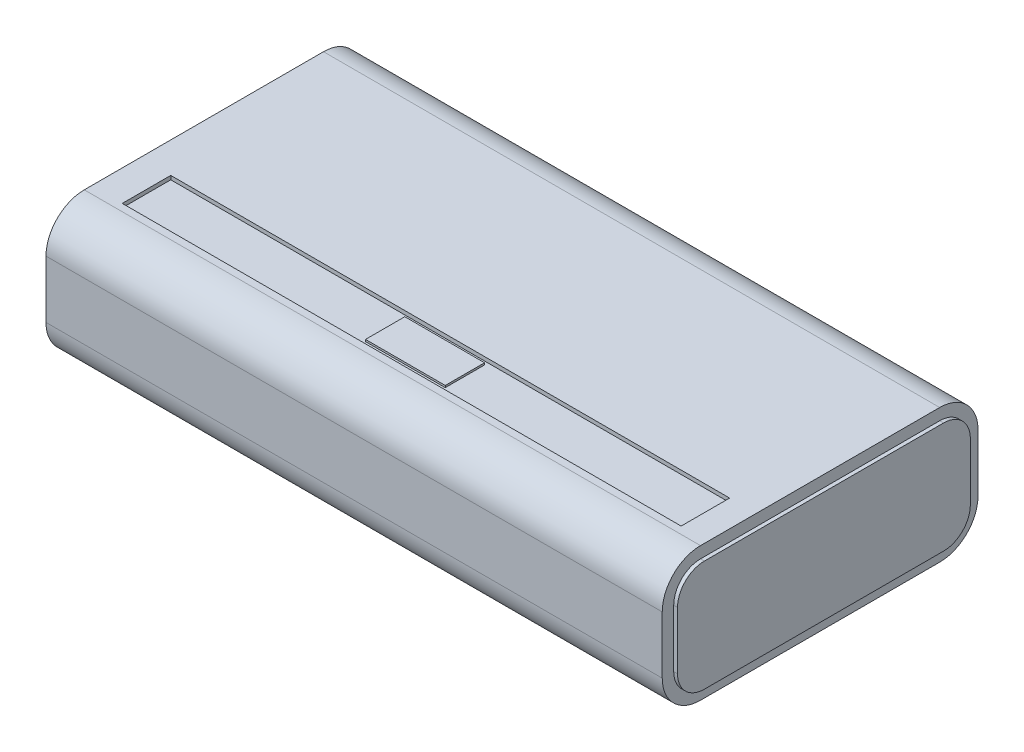
ISO-10303-21;
HEADER;
FILE_DESCRIPTION(('STEP AP214'),'2;1');
FILE_NAME('part.step','',(''),(''),'','','');
FILE_SCHEMA(('AUTOMOTIVE_DESIGN { 1 0 10303 214 1 1 1 1 }'));
ENDSEC;
DATA;
#1=APPLICATION_CONTEXT('core data for automotive mechanical design processes');
#2=APPLICATION_PROTOCOL_DEFINITION('international standard','automotive_design',2000,#1);
#3=PRODUCT_CONTEXT('',#1,'mechanical');
#4=PRODUCT('Part','Part','',(#3));
#5=PRODUCT_RELATED_PRODUCT_CATEGORY('part','',(#4));
#6=PRODUCT_DEFINITION_FORMATION('','',#4);
#7=PRODUCT_DEFINITION_CONTEXT('part definition',#1,'design');
#8=PRODUCT_DEFINITION('design','',#6,#7);
#9=PRODUCT_DEFINITION_SHAPE('','',#8);
#10=(LENGTH_UNIT() NAMED_UNIT(*) SI_UNIT(.MILLI.,.METRE.));
#11=(NAMED_UNIT(*) PLANE_ANGLE_UNIT() SI_UNIT($,.RADIAN.));
#12=(NAMED_UNIT(*) SI_UNIT($,.STERADIAN.) SOLID_ANGLE_UNIT());
#13=UNCERTAINTY_MEASURE_WITH_UNIT(LENGTH_MEASURE(1.E-05),#10,'distance_accuracy_value','');
#14=(GEOMETRIC_REPRESENTATION_CONTEXT(3) GLOBAL_UNCERTAINTY_ASSIGNED_CONTEXT((#13)) GLOBAL_UNIT_ASSIGNED_CONTEXT((#10,
#11,#12)) REPRESENTATION_CONTEXT('',''));
#15=CARTESIAN_POINT('',(0.,0.,0.));
#16=DIRECTION('',(0.,0.,1.));
#17=DIRECTION('',(1.,0.,0.));
#18=AXIS2_PLACEMENT_3D('',#15,#16,#17);
#19=CARTESIAN_POINT('',(0.,34.,0.));
#20=DIRECTION('',(0.,1.,0.));
#21=DIRECTION('',(0.,0.,1.));
#22=AXIS2_PLACEMENT_3D('',#19,#20,#21);
#23=PLANE('',#22);
#24=DIRECTION('',(0.,0.,1.));
#25=VECTOR('',#24,1.);
#26=CARTESIAN_POINT('',(-72.4679247913291,34.,29.3580079111993));
#27=LINE('',#26,#25);
#28=CARTESIAN_POINT('',(-72.4679247913291,34.,16.6877097600501));
#29=VERTEX_POINT('',#28);
#30=CARTESIAN_POINT('',(-72.4679247913291,34.,29.3580079111993));
#31=VERTEX_POINT('',#30);
#32=EDGE_CURVE('E350',#29,#31,#27,.T.);
#33=ORIENTED_EDGE('',*,*,#32,.T.);
#34=DIRECTION('',(1.,0.,0.));
#35=VECTOR('',#34,1.);
#36=CARTESIAN_POINT('',(73.5495356091101,34.,29.3580079111993));
#37=LINE('',#36,#35);
#38=CARTESIAN_POINT('',(73.5495356091101,34.,29.3580079111993));
#39=VERTEX_POINT('',#38);
#40=EDGE_CURVE('E354',#31,#39,#37,.T.);
#41=ORIENTED_EDGE('',*,*,#40,.T.);
#42=DIRECTION('',(0.,0.,-1.));
#43=VECTOR('',#42,1.);
#44=CARTESIAN_POINT('',(73.5495356091101,34.,29.3580079111993));
#45=LINE('',#44,#43);
#46=CARTESIAN_POINT('',(73.5495356091101,34.,16.6877097600501));
#47=VERTEX_POINT('',#46);
#48=EDGE_CURVE('E359',#39,#47,#45,.T.);
#49=ORIENTED_EDGE('',*,*,#48,.T.);
#50=DIRECTION('',(-1.,0.,0.));
#51=VECTOR('',#50,1.);
#52=CARTESIAN_POINT('',(73.5495356091101,34.,16.6877097600501));
#53=LINE('',#52,#51);
#54=EDGE_CURVE('E363',#47,#29,#53,.T.);
#55=ORIENTED_EDGE('',*,*,#54,.T.);
#56=EDGE_LOOP('',(#33,#41,#49,#55));
#57=FACE_BOUND('',#56,.T.);
#58=DIRECTION('',(1.,0.,0.));
#59=VECTOR('',#58,1.);
#60=CARTESIAN_POINT('',(10.4170922106721,34.,27.8556103776219));
#61=LINE('',#60,#59);
#62=CARTESIAN_POINT('',(-10.4170922106721,34.,27.8556103776219));
#63=VERTEX_POINT('',#62);
#64=CARTESIAN_POINT('',(10.4170922106721,34.,27.8556103776219));
#65=VERTEX_POINT('',#64);
#66=EDGE_CURVE('E1032',#63,#65,#61,.T.);
#67=ORIENTED_EDGE('',*,*,#66,.F.);
#68=DIRECTION('',(0.,0.,1.));
#69=VECTOR('',#68,1.);
#70=CARTESIAN_POINT('',(-10.4170922106721,34.,27.8556103776219));
#71=LINE('',#70,#69);
#72=CARTESIAN_POINT('',(-10.4170922106721,34.,17.5891447485538));
#73=VERTEX_POINT('',#72);
#74=EDGE_CURVE('E337',#73,#63,#71,.T.);
#75=ORIENTED_EDGE('',*,*,#74,.F.);
#76=DIRECTION('',(-1.,0.,0.));
#77=VECTOR('',#76,1.);
#78=CARTESIAN_POINT('',(10.4170922106721,34.,17.5891447485538));
#79=LINE('',#78,#77);
#80=CARTESIAN_POINT('',(10.4170922106721,34.,17.5891447485538));
#81=VERTEX_POINT('',#80);
#82=EDGE_CURVE('E333',#81,#73,#79,.T.);
#83=ORIENTED_EDGE('',*,*,#82,.F.);
#84=DIRECTION('',(0.,0.,-1.));
#85=VECTOR('',#84,1.);
#86=CARTESIAN_POINT('',(10.4170922106721,34.,27.8556103776219));
#87=LINE('',#86,#85);
#88=EDGE_CURVE('E1043',#65,#81,#87,.T.);
#89=ORIENTED_EDGE('',*,*,#88,.F.);
#90=EDGE_LOOP('',(#67,#75,#83,#89));
#91=FACE_BOUND('',#90,.T.);
#92=ADVANCED_FACE('F38',(#57,#91),#23,.T.);
#93=CARTESIAN_POINT('',(-80.5,35.,41.25));
#94=DIRECTION('',(1.,0.,0.));
#95=DIRECTION('',(0.,0.,-1.));
#96=AXIS2_PLACEMENT_3D('',#93,#94,#95);
#97=PLANE('',#96);
#98=DIRECTION('',(0.,0.,1.));
#99=VECTOR('',#98,1.);
#100=CARTESIAN_POINT('',(-80.5,35.,41.25));
#101=LINE('',#100,#99);
#102=CARTESIAN_POINT('',(-80.5,35.,-31.25));
#103=VERTEX_POINT('',#102);
#104=CARTESIAN_POINT('',(-80.5,35.,31.25));
#105=VERTEX_POINT('',#104);
#106=EDGE_CURVE('E568',#103,#105,#101,.T.);
#107=ORIENTED_EDGE('',*,*,#106,.F.);
#108=CARTESIAN_POINT('',(-80.5,25.,-31.25));
#109=DIRECTION('',(1.,0.,0.));
#110=DIRECTION('',(0.,0.,-1.));
#111=AXIS2_PLACEMENT_3D('',#108,#109,#110);
#112=CIRCLE('',#111,10.);
#113=CARTESIAN_POINT('',(-80.5,25.,-41.25));
#114=VERTEX_POINT('',#113);
#115=EDGE_CURVE('E616',#103,#114,#112,.F.);
#116=ORIENTED_EDGE('',*,*,#115,.T.);
#117=DIRECTION('',(0.,-1.,0.));
#118=VECTOR('',#117,1.);
#119=CARTESIAN_POINT('',(-80.5,35.,-41.25));
#120=LINE('',#119,#118);
#121=CARTESIAN_POINT('',(-80.5,10.,-41.25));
#122=VERTEX_POINT('',#121);
#123=EDGE_CURVE('E577',#114,#122,#120,.T.);
#124=ORIENTED_EDGE('',*,*,#123,.T.);
#125=CARTESIAN_POINT('',(-80.5,10.,-31.25));
#126=DIRECTION('',(1.,0.,0.));
#127=DIRECTION('',(0.,0.,-1.));
#128=AXIS2_PLACEMENT_3D('',#125,#126,#127);
#129=CIRCLE('',#128,10.);
#130=CARTESIAN_POINT('',(-80.5,0.,-31.25));
#131=VERTEX_POINT('',#130);
#132=EDGE_CURVE('E613',#122,#131,#129,.F.);
#133=ORIENTED_EDGE('',*,*,#132,.T.);
#134=DIRECTION('',(0.,0.,1.));
#135=VECTOR('',#134,1.);
#136=CARTESIAN_POINT('',(-80.5,0.,41.25));
#137=LINE('',#136,#135);
#138=CARTESIAN_POINT('',(-80.5,0.,31.25));
#139=VERTEX_POINT('',#138);
#140=EDGE_CURVE('E567',#131,#139,#137,.T.);
#141=ORIENTED_EDGE('',*,*,#140,.T.);
#142=CARTESIAN_POINT('',(-80.5,10.,31.25));
#143=DIRECTION('',(1.,0.,0.));
#144=DIRECTION('',(0.,0.,-1.));
#145=AXIS2_PLACEMENT_3D('',#142,#143,#144);
#146=CIRCLE('',#145,10.);
#147=CARTESIAN_POINT('',(-80.5,10.,41.25));
#148=VERTEX_POINT('',#147);
#149=EDGE_CURVE('E610',#139,#148,#146,.F.);
#150=ORIENTED_EDGE('',*,*,#149,.T.);
#151=DIRECTION('',(0.,-1.,0.));
#152=VECTOR('',#151,1.);
#153=CARTESIAN_POINT('',(-80.5,35.,41.25));
#154=LINE('',#153,#152);
#155=CARTESIAN_POINT('',(-80.5,25.,41.25));
#156=VERTEX_POINT('',#155);
#157=EDGE_CURVE('E595',#156,#148,#154,.T.);
#158=ORIENTED_EDGE('',*,*,#157,.F.);
#159=CARTESIAN_POINT('',(-80.5,25.,31.25));
#160=DIRECTION('',(1.,0.,0.));
#161=DIRECTION('',(0.,0.,-1.));
#162=AXIS2_PLACEMENT_3D('',#159,#160,#161);
#163=CIRCLE('',#162,10.);
#164=EDGE_CURVE('E607',#156,#105,#163,.F.);
#165=ORIENTED_EDGE('',*,*,#164,.T.);
#166=EDGE_LOOP('',(#107,#116,#124,#133,#141,#150,#158,#165));
#167=FACE_BOUND('',#166,.T.);
#168=CARTESIAN_POINT('',(-80.5,25.,31.25));
#169=DIRECTION('',(-1.,0.,0.));
#170=DIRECTION('',(0.,0.,1.));
#171=AXIS2_PLACEMENT_3D('',#168,#169,#170);
#172=CIRCLE('',#171,7.);
#173=CARTESIAN_POINT('',(-80.5,25.,38.25));
#174=VERTEX_POINT('',#173);
#175=CARTESIAN_POINT('',(-80.5,32.,31.25));
#176=VERTEX_POINT('',#175);
#177=EDGE_CURVE('E381',#174,#176,#172,.T.);
#178=ORIENTED_EDGE('',*,*,#177,.F.);
#179=DIRECTION('',(0.,1.,0.));
#180=VECTOR('',#179,1.);
#181=CARTESIAN_POINT('',(-80.5,10.,38.25));
#182=LINE('',#181,#180);
#183=CARTESIAN_POINT('',(-80.5,10.,38.25));
#184=VERTEX_POINT('',#183);
#185=EDGE_CURVE('E395',#184,#174,#182,.T.);
#186=ORIENTED_EDGE('',*,*,#185,.F.);
#187=CARTESIAN_POINT('',(-80.5,10.,31.25));
#188=DIRECTION('',(-1.,0.,0.));
#189=DIRECTION('',(0.,0.,1.));
#190=AXIS2_PLACEMENT_3D('',#187,#188,#189);
#191=CIRCLE('',#190,7.);
#192=CARTESIAN_POINT('',(-80.5,3.,31.25));
#193=VERTEX_POINT('',#192);
#194=EDGE_CURVE('E440',#193,#184,#191,.T.);
#195=ORIENTED_EDGE('',*,*,#194,.F.);
#196=DIRECTION('',(0.,0.,1.));
#197=VECTOR('',#196,1.);
#198=CARTESIAN_POINT('',(-80.5,3.,-31.25));
#199=LINE('',#198,#197);
#200=CARTESIAN_POINT('',(-80.5,3.,-31.25));
#201=VERTEX_POINT('',#200);
#202=EDGE_CURVE('E436',#201,#193,#199,.T.);
#203=ORIENTED_EDGE('',*,*,#202,.F.);
#204=CARTESIAN_POINT('',(-80.5,10.,-31.25));
#205=DIRECTION('',(-1.,0.,0.));
#206=DIRECTION('',(0.,0.,1.));
#207=AXIS2_PLACEMENT_3D('',#204,#205,#206);
#208=CIRCLE('',#207,7.);
#209=CARTESIAN_POINT('',(-80.5,10.,-38.25));
#210=VERTEX_POINT('',#209);
#211=EDGE_CURVE('E432',#210,#201,#208,.T.);
#212=ORIENTED_EDGE('',*,*,#211,.F.);
#213=DIRECTION('',(0.,-1.,0.));
#214=VECTOR('',#213,1.);
#215=CARTESIAN_POINT('',(-80.5,25.,-38.25));
#216=LINE('',#215,#214);
#217=CARTESIAN_POINT('',(-80.5,25.,-38.25));
#218=VERTEX_POINT('',#217);
#219=EDGE_CURVE('E428',#218,#210,#216,.T.);
#220=ORIENTED_EDGE('',*,*,#219,.F.);
#221=CARTESIAN_POINT('',(-80.5,25.,-31.25));
#222=DIRECTION('',(-1.,0.,0.));
#223=DIRECTION('',(0.,0.,1.));
#224=AXIS2_PLACEMENT_3D('',#221,#222,#223);
#225=CIRCLE('',#224,7.);
#226=CARTESIAN_POINT('',(-80.5,32.,-31.25));
#227=VERTEX_POINT('',#226);
#228=EDGE_CURVE('E424',#227,#218,#225,.T.);
#229=ORIENTED_EDGE('',*,*,#228,.F.);
#230=DIRECTION('',(0.,0.,-1.));
#231=VECTOR('',#230,1.);
#232=CARTESIAN_POINT('',(-80.5,32.,31.25));
#233=LINE('',#232,#231);
#234=EDGE_CURVE('E420',#176,#227,#233,.T.);
#235=ORIENTED_EDGE('',*,*,#234,.F.);
#236=EDGE_LOOP('',(#178,#186,#195,#203,#212,#220,#229,#235));
#237=FACE_BOUND('',#236,.T.);
#238=ADVANCED_FACE('F654',(#167,#237),#97,.F.);
#239=CARTESIAN_POINT('',(80.5,35.,41.25));
#240=DIRECTION('',(-1.,0.,0.));
#241=DIRECTION('',(0.,0.,1.));
#242=AXIS2_PLACEMENT_3D('',#239,#240,#241);
#243=PLANE('',#242);
#244=DIRECTION('',(0.,-1.,0.));
#245=VECTOR('',#244,1.);
#246=CARTESIAN_POINT('',(80.5,35.,-41.25));
#247=LINE('',#246,#245);
#248=CARTESIAN_POINT('',(80.5,25.,-41.25));
#249=VERTEX_POINT('',#248);
#250=CARTESIAN_POINT('',(80.5,10.,-41.25));
#251=VERTEX_POINT('',#250);
#252=EDGE_CURVE('E587',#249,#251,#247,.T.);
#253=ORIENTED_EDGE('',*,*,#252,.F.);
#254=CARTESIAN_POINT('',(80.5,25.,-31.25));
#255=DIRECTION('',(-1.,0.,0.));
#256=DIRECTION('',(0.,0.,1.));
#257=AXIS2_PLACEMENT_3D('',#254,#255,#256);
#258=CIRCLE('',#257,10.);
#259=CARTESIAN_POINT('',(80.5,35.,-31.25));
#260=VERTEX_POINT('',#259);
#261=EDGE_CURVE('E635',#249,#260,#258,.F.);
#262=ORIENTED_EDGE('',*,*,#261,.T.);
#263=DIRECTION('',(0.,0.,-1.));
#264=VECTOR('',#263,1.);
#265=CARTESIAN_POINT('',(80.5,35.,41.25));
#266=LINE('',#265,#264);
#267=CARTESIAN_POINT('',(80.5,35.,31.25));
#268=VERTEX_POINT('',#267);
#269=EDGE_CURVE('E572',#268,#260,#266,.T.);
#270=ORIENTED_EDGE('',*,*,#269,.F.);
#271=CARTESIAN_POINT('',(80.5,25.,31.25));
#272=DIRECTION('',(-1.,0.,0.));
#273=DIRECTION('',(0.,0.,1.));
#274=AXIS2_PLACEMENT_3D('',#271,#272,#273);
#275=CIRCLE('',#274,10.);
#276=CARTESIAN_POINT('',(80.5,25.,41.25));
#277=VERTEX_POINT('',#276);
#278=EDGE_CURVE('E626',#268,#277,#275,.F.);
#279=ORIENTED_EDGE('',*,*,#278,.T.);
#280=DIRECTION('',(0.,-1.,0.));
#281=VECTOR('',#280,1.);
#282=CARTESIAN_POINT('',(80.5,35.,41.25));
#283=LINE('',#282,#281);
#284=CARTESIAN_POINT('',(80.5,10.,41.25));
#285=VERTEX_POINT('',#284);
#286=EDGE_CURVE('E591',#277,#285,#283,.T.);
#287=ORIENTED_EDGE('',*,*,#286,.T.);
#288=CARTESIAN_POINT('',(80.5,10.,31.25));
#289=DIRECTION('',(-1.,0.,0.));
#290=DIRECTION('',(0.,0.,1.));
#291=AXIS2_PLACEMENT_3D('',#288,#289,#290);
#292=CIRCLE('',#291,10.);
#293=CARTESIAN_POINT('',(80.5,0.,31.25));
#294=VERTEX_POINT('',#293);
#295=EDGE_CURVE('E629',#285,#294,#292,.F.);
#296=ORIENTED_EDGE('',*,*,#295,.T.);
#297=DIRECTION('',(0.,0.,-1.));
#298=VECTOR('',#297,1.);
#299=CARTESIAN_POINT('',(80.5,0.,41.25));
#300=LINE('',#299,#298);
#301=CARTESIAN_POINT('',(80.5,0.,-31.25));
#302=VERTEX_POINT('',#301);
#303=EDGE_CURVE('E573',#294,#302,#300,.T.);
#304=ORIENTED_EDGE('',*,*,#303,.T.);
#305=CARTESIAN_POINT('',(80.5,10.,-31.25));
#306=DIRECTION('',(-1.,0.,0.));
#307=DIRECTION('',(0.,0.,1.));
#308=AXIS2_PLACEMENT_3D('',#305,#306,#307);
#309=CIRCLE('',#308,10.);
#310=EDGE_CURVE('E632',#302,#251,#309,.F.);
#311=ORIENTED_EDGE('',*,*,#310,.T.);
#312=EDGE_LOOP('',(#253,#262,#270,#279,#287,#296,#304,#311));
#313=FACE_BOUND('',#312,.T.);
#314=CARTESIAN_POINT('',(80.5,10.,-31.25));
#315=DIRECTION('',(1.,0.,0.));
#316=DIRECTION('',(0.,0.,-1.));
#317=AXIS2_PLACEMENT_3D('',#314,#315,#316);
#318=CIRCLE('',#317,7.);
#319=CARTESIAN_POINT('',(80.5,3.,-31.25));
#320=VERTEX_POINT('',#319);
#321=CARTESIAN_POINT('',(80.5,10.,-38.25));
#322=VERTEX_POINT('',#321);
#323=EDGE_CURVE('E478',#320,#322,#318,.T.);
#324=ORIENTED_EDGE('',*,*,#323,.F.);
#325=DIRECTION('',(0.,0.,-1.));
#326=VECTOR('',#325,1.);
#327=CARTESIAN_POINT('',(80.5,3.,31.25));
#328=LINE('',#327,#326);
#329=CARTESIAN_POINT('',(80.5,3.,31.25));
#330=VERTEX_POINT('',#329);
#331=EDGE_CURVE('E484',#330,#320,#328,.T.);
#332=ORIENTED_EDGE('',*,*,#331,.F.);
#333=CARTESIAN_POINT('',(80.5,10.,31.25));
#334=DIRECTION('',(1.,0.,0.));
#335=DIRECTION('',(0.,0.,-1.));
#336=AXIS2_PLACEMENT_3D('',#333,#334,#335);
#337=CIRCLE('',#336,7.);
#338=CARTESIAN_POINT('',(80.5,10.,38.25));
#339=VERTEX_POINT('',#338);
#340=EDGE_CURVE('E529',#339,#330,#337,.T.);
#341=ORIENTED_EDGE('',*,*,#340,.F.);
#342=DIRECTION('',(0.,-1.,0.));
#343=VECTOR('',#342,1.);
#344=CARTESIAN_POINT('',(80.5,25.,38.25));
#345=LINE('',#344,#343);
#346=CARTESIAN_POINT('',(80.5,25.,38.25));
#347=VERTEX_POINT('',#346);
#348=EDGE_CURVE('E525',#347,#339,#345,.T.);
#349=ORIENTED_EDGE('',*,*,#348,.F.);
#350=CARTESIAN_POINT('',(80.5,25.,31.25));
#351=DIRECTION('',(1.,0.,0.));
#352=DIRECTION('',(0.,0.,-1.));
#353=AXIS2_PLACEMENT_3D('',#350,#351,#352);
#354=CIRCLE('',#353,7.);
#355=CARTESIAN_POINT('',(80.5,32.,31.25));
#356=VERTEX_POINT('',#355);
#357=EDGE_CURVE('E521',#356,#347,#354,.T.);
#358=ORIENTED_EDGE('',*,*,#357,.F.);
#359=DIRECTION('',(0.,0.,1.));
#360=VECTOR('',#359,1.);
#361=CARTESIAN_POINT('',(80.5,32.,-31.25));
#362=LINE('',#361,#360);
#363=CARTESIAN_POINT('',(80.5,32.,-31.25));
#364=VERTEX_POINT('',#363);
#365=EDGE_CURVE('E517',#364,#356,#362,.T.);
#366=ORIENTED_EDGE('',*,*,#365,.F.);
#367=CARTESIAN_POINT('',(80.5,25.,-31.25));
#368=DIRECTION('',(1.,0.,0.));
#369=DIRECTION('',(0.,0.,-1.));
#370=AXIS2_PLACEMENT_3D('',#367,#368,#369);
#371=CIRCLE('',#370,7.);
#372=CARTESIAN_POINT('',(80.5,25.,-38.25));
#373=VERTEX_POINT('',#372);
#374=EDGE_CURVE('E513',#373,#364,#371,.T.);
#375=ORIENTED_EDGE('',*,*,#374,.F.);
#376=DIRECTION('',(0.,1.,0.));
#377=VECTOR('',#376,1.);
#378=CARTESIAN_POINT('',(80.5,10.,-38.25));
#379=LINE('',#378,#377);
#380=EDGE_CURVE('E509',#322,#373,#379,.T.);
#381=ORIENTED_EDGE('',*,*,#380,.F.);
#382=EDGE_LOOP('',(#324,#332,#341,#349,#358,#366,#375,#381));
#383=FACE_BOUND('',#382,.T.);
#384=ADVANCED_FACE('F664',(#313,#383),#243,.F.);
#385=CARTESIAN_POINT('',(80.5,35.,41.25));
#386=DIRECTION('',(0.,0.,-1.));
#387=DIRECTION('',(-1.,0.,0.));
#388=AXIS2_PLACEMENT_3D('',#385,#386,#387);
#389=PLANE('',#388);
#390=ORIENTED_EDGE('',*,*,#157,.T.);
#391=DIRECTION('',(1.,0.,0.));
#392=VECTOR('',#391,1.);
#393=CARTESIAN_POINT('',(80.5,10.,41.25));
#394=LINE('',#393,#392);
#395=EDGE_CURVE('E11',#148,#285,#394,.T.);
#396=ORIENTED_EDGE('',*,*,#395,.T.);
#397=ORIENTED_EDGE('',*,*,#286,.F.);
#398=DIRECTION('',(1.,0.,0.));
#399=VECTOR('',#398,1.);
#400=CARTESIAN_POINT('',(-80.5,25.,41.25));
#401=LINE('',#400,#399);
#402=EDGE_CURVE('E47',#277,#156,#401,.F.);
#403=ORIENTED_EDGE('',*,*,#402,.T.);
#404=EDGE_LOOP('',(#390,#396,#397,#403));
#405=FACE_BOUND('',#404,.T.);
#406=ADVANCED_FACE('F648',(#405),#389,.F.);
#407=CARTESIAN_POINT('',(80.5,35.,-41.25));
#408=DIRECTION('',(0.,0.,1.));
#409=DIRECTION('',(1.,0.,0.));
#410=AXIS2_PLACEMENT_3D('',#407,#408,#409);
#411=PLANE('',#410);
#412=ORIENTED_EDGE('',*,*,#123,.F.);
#413=DIRECTION('',(-1.,0.,0.));
#414=VECTOR('',#413,1.);
#415=CARTESIAN_POINT('',(80.5,25.,-41.25));
#416=LINE('',#415,#414);
#417=EDGE_CURVE('E623',#114,#249,#416,.F.);
#418=ORIENTED_EDGE('',*,*,#417,.T.);
#419=ORIENTED_EDGE('',*,*,#252,.T.);
#420=DIRECTION('',(-1.,0.,0.));
#421=VECTOR('',#420,1.);
#422=CARTESIAN_POINT('',(80.5,10.,-41.25));
#423=LINE('',#422,#421);
#424=EDGE_CURVE('E619',#251,#122,#423,.T.);
#425=ORIENTED_EDGE('',*,*,#424,.T.);
#426=EDGE_LOOP('',(#412,#418,#419,#425));
#427=FACE_BOUND('',#426,.T.);
#428=ADVANCED_FACE('F672',(#427),#411,.F.);
#429=CARTESIAN_POINT('',(0.,35.,0.));
#430=DIRECTION('',(0.,1.,0.));
#431=DIRECTION('',(0.,0.,1.));
#432=AXIS2_PLACEMENT_3D('',#429,#430,#431);
#433=PLANE('',#432);
#434=DIRECTION('',(0.,0.,1.));
#435=VECTOR('',#434,1.);
#436=CARTESIAN_POINT('',(-72.4679247913291,35.,29.3580079111993));
#437=LINE('',#436,#435);
#438=CARTESIAN_POINT('',(-72.4679247913291,35.,16.6877097600501));
#439=VERTEX_POINT('',#438);
#440=CARTESIAN_POINT('',(-72.4679247913291,35.,29.3580079111993));
#441=VERTEX_POINT('',#440);
#442=EDGE_CURVE('E68',#439,#441,#437,.T.);
#443=ORIENTED_EDGE('',*,*,#442,.F.);
#444=DIRECTION('',(-1.,0.,0.));
#445=VECTOR('',#444,1.);
#446=CARTESIAN_POINT('',(73.5495356091101,35.,16.6877097600501));
#447=LINE('',#446,#445);
#448=CARTESIAN_POINT('',(73.5495356091101,35.,16.6877097600501));
#449=VERTEX_POINT('',#448);
#450=EDGE_CURVE('E355',#449,#439,#447,.T.);
#451=ORIENTED_EDGE('',*,*,#450,.F.);
#452=DIRECTION('',(0.,0.,-1.));
#453=VECTOR('',#452,1.);
#454=CARTESIAN_POINT('',(73.5495356091101,35.,29.3580079111993));
#455=LINE('',#454,#453);
#456=CARTESIAN_POINT('',(73.5495356091101,35.,29.3580079111993));
#457=VERTEX_POINT('',#456);
#458=EDGE_CURVE('E371',#457,#449,#455,.T.);
#459=ORIENTED_EDGE('',*,*,#458,.F.);
#460=DIRECTION('',(1.,0.,0.));
#461=VECTOR('',#460,1.);
#462=CARTESIAN_POINT('',(73.5495356091101,35.,29.3580079111993));
#463=LINE('',#462,#461);
#464=EDGE_CURVE('E344',#441,#457,#463,.T.);
#465=ORIENTED_EDGE('',*,*,#464,.F.);
#466=EDGE_LOOP('',(#443,#451,#459,#465));
#467=FACE_BOUND('',#466,.T.);
#468=ORIENTED_EDGE('',*,*,#269,.T.);
#469=DIRECTION('',(-1.,0.,0.));
#470=VECTOR('',#469,1.);
#471=CARTESIAN_POINT('',(-80.5,35.,-31.25));
#472=LINE('',#471,#470);
#473=EDGE_CURVE('E603',#260,#103,#472,.T.);
#474=ORIENTED_EDGE('',*,*,#473,.T.);
#475=ORIENTED_EDGE('',*,*,#106,.T.);
#476=DIRECTION('',(1.,0.,0.));
#477=VECTOR('',#476,1.);
#478=CARTESIAN_POINT('',(80.5,35.,31.25));
#479=LINE('',#478,#477);
#480=EDGE_CURVE('E599',#105,#268,#479,.T.);
#481=ORIENTED_EDGE('',*,*,#480,.T.);
#482=EDGE_LOOP('',(#468,#474,#475,#481));
#483=FACE_BOUND('',#482,.T.);
#484=ADVANCED_FACE('F660',(#467,#483),#433,.T.);
#485=CARTESIAN_POINT('',(0.,0.,0.));
#486=DIRECTION('',(0.,1.,0.));
#487=DIRECTION('',(0.,0.,1.));
#488=AXIS2_PLACEMENT_3D('',#485,#486,#487);
#489=PLANE('',#488);
#490=ORIENTED_EDGE('',*,*,#140,.F.);
#491=DIRECTION('',(-1.,0.,0.));
#492=VECTOR('',#491,1.);
#493=CARTESIAN_POINT('',(0.,0.,-31.25));
#494=LINE('',#493,#492);
#495=EDGE_CURVE('E641',#131,#302,#494,.F.);
#496=ORIENTED_EDGE('',*,*,#495,.T.);
#497=ORIENTED_EDGE('',*,*,#303,.F.);
#498=DIRECTION('',(1.,0.,0.));
#499=VECTOR('',#498,1.);
#500=CARTESIAN_POINT('',(0.,0.,31.25));
#501=LINE('',#500,#499);
#502=EDGE_CURVE('E638',#294,#139,#501,.F.);
#503=ORIENTED_EDGE('',*,*,#502,.T.);
#504=EDGE_LOOP('',(#490,#496,#497,#503));
#505=FACE_BOUND('',#504,.T.);
#506=ADVANCED_FACE('F680',(#505),#489,.F.);
#507=CARTESIAN_POINT('',(0.,25.,-31.25));
#508=DIRECTION('',(1.,0.,0.));
#509=DIRECTION('',(0.,0.,-1.));
#510=AXIS2_PLACEMENT_3D('',#507,#508,#509);
#511=CYLINDRICAL_SURFACE('',#510,10.);
#512=ORIENTED_EDGE('',*,*,#261,.F.);
#513=ORIENTED_EDGE('',*,*,#417,.F.);
#514=ORIENTED_EDGE('',*,*,#115,.F.);
#515=ORIENTED_EDGE('',*,*,#473,.F.);
#516=EDGE_LOOP('',(#512,#513,#514,#515));
#517=FACE_BOUND('',#516,.T.);
#518=ADVANCED_FACE('F669',(#517),#511,.T.);
#519=CARTESIAN_POINT('',(80.5,10.,-31.25));
#520=DIRECTION('',(-1.,0.,0.));
#521=DIRECTION('',(0.,0.,1.));
#522=AXIS2_PLACEMENT_3D('',#519,#520,#521);
#523=CYLINDRICAL_SURFACE('',#522,10.);
#524=ORIENTED_EDGE('',*,*,#310,.F.);
#525=ORIENTED_EDGE('',*,*,#495,.F.);
#526=ORIENTED_EDGE('',*,*,#132,.F.);
#527=ORIENTED_EDGE('',*,*,#424,.F.);
#528=EDGE_LOOP('',(#524,#525,#526,#527));
#529=FACE_BOUND('',#528,.T.);
#530=ADVANCED_FACE('F676',(#529),#523,.T.);
#531=CARTESIAN_POINT('',(80.5,10.,31.25));
#532=DIRECTION('',(1.,0.,0.));
#533=DIRECTION('',(0.,0.,-1.));
#534=AXIS2_PLACEMENT_3D('',#531,#532,#533);
#535=CYLINDRICAL_SURFACE('',#534,10.);
#536=ORIENTED_EDGE('',*,*,#149,.F.);
#537=ORIENTED_EDGE('',*,*,#502,.F.);
#538=ORIENTED_EDGE('',*,*,#295,.F.);
#539=ORIENTED_EDGE('',*,*,#395,.F.);
#540=EDGE_LOOP('',(#536,#537,#538,#539));
#541=FACE_BOUND('',#540,.T.);
#542=ADVANCED_FACE('F684',(#541),#535,.T.);
#543=CARTESIAN_POINT('',(0.,25.,31.25));
#544=DIRECTION('',(-1.,0.,0.));
#545=DIRECTION('',(0.,0.,1.));
#546=AXIS2_PLACEMENT_3D('',#543,#544,#545);
#547=CYLINDRICAL_SURFACE('',#546,10.);
#548=ORIENTED_EDGE('',*,*,#164,.F.);
#549=ORIENTED_EDGE('',*,*,#402,.F.);
#550=ORIENTED_EDGE('',*,*,#278,.F.);
#551=ORIENTED_EDGE('',*,*,#480,.F.);
#552=EDGE_LOOP('',(#548,#549,#550,#551));
#553=FACE_BOUND('',#552,.T.);
#554=ADVANCED_FACE('F40',(#553),#547,.T.);
#555=CARTESIAN_POINT('',(81.5,10.,-31.25));
#556=DIRECTION('',(-1.,0.,0.));
#557=DIRECTION('',(0.,0.,1.));
#558=AXIS2_PLACEMENT_3D('',#555,#556,#557);
#559=CYLINDRICAL_SURFACE('',#558,7.);
#560=ORIENTED_EDGE('',*,*,#323,.T.);
#561=DIRECTION('',(-1.,0.,0.));
#562=VECTOR('',#561,1.);
#563=CARTESIAN_POINT('',(81.5,10.,-38.25));
#564=LINE('',#563,#562);
#565=CARTESIAN_POINT('',(81.5,10.,-38.25));
#566=VERTEX_POINT('',#565);
#567=EDGE_CURVE('E563',#566,#322,#564,.T.);
#568=ORIENTED_EDGE('',*,*,#567,.F.);
#569=CARTESIAN_POINT('',(81.5,10.,-31.25));
#570=DIRECTION('',(1.,0.,0.));
#571=DIRECTION('',(0.,0.,-1.));
#572=AXIS2_PLACEMENT_3D('',#569,#570,#571);
#573=CIRCLE('',#572,7.);
#574=CARTESIAN_POINT('',(81.5,3.,-31.25));
#575=VERTEX_POINT('',#574);
#576=EDGE_CURVE('E479',#575,#566,#573,.T.);
#577=ORIENTED_EDGE('',*,*,#576,.F.);
#578=DIRECTION('',(-1.,0.,0.));
#579=VECTOR('',#578,1.);
#580=CARTESIAN_POINT('',(81.5,3.,-31.25));
#581=LINE('',#580,#579);
#582=EDGE_CURVE('E505',#575,#320,#581,.T.);
#583=ORIENTED_EDGE('',*,*,#582,.T.);
#584=EDGE_LOOP('',(#560,#568,#577,#583));
#585=FACE_BOUND('',#584,.T.);
#586=ADVANCED_FACE('F690',(#585),#559,.T.);
#587=CARTESIAN_POINT('',(81.5,10.,-38.25));
#588=DIRECTION('',(0.,0.,1.));
#589=DIRECTION('',(1.,0.,0.));
#590=AXIS2_PLACEMENT_3D('',#587,#588,#589);
#591=PLANE('',#590);
#592=ORIENTED_EDGE('',*,*,#380,.T.);
#593=DIRECTION('',(-1.,0.,0.));
#594=VECTOR('',#593,1.);
#595=CARTESIAN_POINT('',(81.5,25.,-38.25));
#596=LINE('',#595,#594);
#597=CARTESIAN_POINT('',(81.5,25.,-38.25));
#598=VERTEX_POINT('',#597);
#599=EDGE_CURVE('E559',#598,#373,#596,.T.);
#600=ORIENTED_EDGE('',*,*,#599,.F.);
#601=DIRECTION('',(0.,1.,0.));
#602=VECTOR('',#601,1.);
#603=CARTESIAN_POINT('',(81.5,10.,-38.25));
#604=LINE('',#603,#602);
#605=EDGE_CURVE('E483',#566,#598,#604,.T.);
#606=ORIENTED_EDGE('',*,*,#605,.F.);
#607=ORIENTED_EDGE('',*,*,#567,.T.);
#608=EDGE_LOOP('',(#592,#600,#606,#607));
#609=FACE_BOUND('',#608,.T.);
#610=ADVANCED_FACE('F781',(#609),#591,.F.);
#611=CARTESIAN_POINT('',(81.5,25.,-31.25));
#612=DIRECTION('',(-1.,0.,0.));
#613=DIRECTION('',(0.,0.,1.));
#614=AXIS2_PLACEMENT_3D('',#611,#612,#613);
#615=CYLINDRICAL_SURFACE('',#614,7.);
#616=ORIENTED_EDGE('',*,*,#374,.T.);
#617=DIRECTION('',(-1.,0.,0.));
#618=VECTOR('',#617,1.);
#619=CARTESIAN_POINT('',(81.5,32.,-31.25));
#620=LINE('',#619,#618);
#621=CARTESIAN_POINT('',(81.5,32.,-31.25));
#622=VERTEX_POINT('',#621);
#623=EDGE_CURVE('E555',#622,#364,#620,.T.);
#624=ORIENTED_EDGE('',*,*,#623,.F.);
#625=CARTESIAN_POINT('',(81.5,25.,-31.25));
#626=DIRECTION('',(1.,0.,0.));
#627=DIRECTION('',(0.,0.,-1.));
#628=AXIS2_PLACEMENT_3D('',#625,#626,#627);
#629=CIRCLE('',#628,7.);
#630=EDGE_CURVE('E487',#598,#622,#629,.T.);
#631=ORIENTED_EDGE('',*,*,#630,.F.);
#632=ORIENTED_EDGE('',*,*,#599,.T.);
#633=EDGE_LOOP('',(#616,#624,#631,#632));
#634=FACE_BOUND('',#633,.T.);
#635=ADVANCED_FACE('F777',(#634),#615,.T.);
#636=CARTESIAN_POINT('',(81.5,32.,-31.25));
#637=DIRECTION('',(0.,-1.,0.));
#638=DIRECTION('',(0.,0.,-1.));
#639=AXIS2_PLACEMENT_3D('',#636,#637,#638);
#640=PLANE('',#639);
#641=ORIENTED_EDGE('',*,*,#365,.T.);
#642=DIRECTION('',(-1.,0.,0.));
#643=VECTOR('',#642,1.);
#644=CARTESIAN_POINT('',(81.5,32.,31.25));
#645=LINE('',#644,#643);
#646=CARTESIAN_POINT('',(81.5,32.,31.25));
#647=VERTEX_POINT('',#646);
#648=EDGE_CURVE('E551',#647,#356,#645,.T.);
#649=ORIENTED_EDGE('',*,*,#648,.F.);
#650=DIRECTION('',(0.,0.,1.));
#651=VECTOR('',#650,1.);
#652=CARTESIAN_POINT('',(81.5,32.,-31.25));
#653=LINE('',#652,#651);
#654=EDGE_CURVE('E490',#622,#647,#653,.T.);
#655=ORIENTED_EDGE('',*,*,#654,.F.);
#656=ORIENTED_EDGE('',*,*,#623,.T.);
#657=EDGE_LOOP('',(#641,#649,#655,#656));
#658=FACE_BOUND('',#657,.T.);
#659=ADVANCED_FACE('F773',(#658),#640,.F.);
#660=CARTESIAN_POINT('',(81.5,25.,31.25));
#661=DIRECTION('',(-1.,0.,0.));
#662=DIRECTION('',(0.,0.,1.));
#663=AXIS2_PLACEMENT_3D('',#660,#661,#662);
#664=CYLINDRICAL_SURFACE('',#663,7.);
#665=ORIENTED_EDGE('',*,*,#357,.T.);
#666=DIRECTION('',(-1.,0.,0.));
#667=VECTOR('',#666,1.);
#668=CARTESIAN_POINT('',(81.5,25.,38.25));
#669=LINE('',#668,#667);
#670=CARTESIAN_POINT('',(81.5,25.,38.25));
#671=VERTEX_POINT('',#670);
#672=EDGE_CURVE('E547',#671,#347,#669,.T.);
#673=ORIENTED_EDGE('',*,*,#672,.F.);
#674=CARTESIAN_POINT('',(81.5,25.,31.25));
#675=DIRECTION('',(1.,0.,0.));
#676=DIRECTION('',(0.,0.,-1.));
#677=AXIS2_PLACEMENT_3D('',#674,#675,#676);
#678=CIRCLE('',#677,7.);
#679=EDGE_CURVE('E493',#647,#671,#678,.T.);
#680=ORIENTED_EDGE('',*,*,#679,.F.);
#681=ORIENTED_EDGE('',*,*,#648,.T.);
#682=EDGE_LOOP('',(#665,#673,#680,#681));
#683=FACE_BOUND('',#682,.T.);
#684=ADVANCED_FACE('F769',(#683),#664,.T.);
#685=CARTESIAN_POINT('',(81.5,25.,38.25));
#686=DIRECTION('',(0.,0.,-1.));
#687=DIRECTION('',(-1.,0.,0.));
#688=AXIS2_PLACEMENT_3D('',#685,#686,#687);
#689=PLANE('',#688);
#690=ORIENTED_EDGE('',*,*,#348,.T.);
#691=DIRECTION('',(-1.,0.,0.));
#692=VECTOR('',#691,1.);
#693=CARTESIAN_POINT('',(81.5,10.,38.25));
#694=LINE('',#693,#692);
#695=CARTESIAN_POINT('',(81.5,10.,38.25));
#696=VERTEX_POINT('',#695);
#697=EDGE_CURVE('E543',#696,#339,#694,.T.);
#698=ORIENTED_EDGE('',*,*,#697,.F.);
#699=DIRECTION('',(0.,-1.,0.));
#700=VECTOR('',#699,1.);
#701=CARTESIAN_POINT('',(81.5,25.,38.25));
#702=LINE('',#701,#700);
#703=EDGE_CURVE('E496',#671,#696,#702,.T.);
#704=ORIENTED_EDGE('',*,*,#703,.F.);
#705=ORIENTED_EDGE('',*,*,#672,.T.);
#706=EDGE_LOOP('',(#690,#698,#704,#705));
#707=FACE_BOUND('',#706,.T.);
#708=ADVANCED_FACE('F765',(#707),#689,.F.);
#709=CARTESIAN_POINT('',(81.5,10.,31.25));
#710=DIRECTION('',(-1.,0.,0.));
#711=DIRECTION('',(0.,0.,1.));
#712=AXIS2_PLACEMENT_3D('',#709,#710,#711);
#713=CYLINDRICAL_SURFACE('',#712,7.);
#714=ORIENTED_EDGE('',*,*,#340,.T.);
#715=DIRECTION('',(-1.,0.,0.));
#716=VECTOR('',#715,1.);
#717=CARTESIAN_POINT('',(81.5,3.,31.25));
#718=LINE('',#717,#716);
#719=CARTESIAN_POINT('',(81.5,3.,31.25));
#720=VERTEX_POINT('',#719);
#721=EDGE_CURVE('E539',#720,#330,#718,.T.);
#722=ORIENTED_EDGE('',*,*,#721,.F.);
#723=CARTESIAN_POINT('',(81.5,10.,31.25));
#724=DIRECTION('',(1.,0.,0.));
#725=DIRECTION('',(0.,0.,-1.));
#726=AXIS2_PLACEMENT_3D('',#723,#724,#725);
#727=CIRCLE('',#726,7.);
#728=EDGE_CURVE('E499',#696,#720,#727,.T.);
#729=ORIENTED_EDGE('',*,*,#728,.F.);
#730=ORIENTED_EDGE('',*,*,#697,.T.);
#731=EDGE_LOOP('',(#714,#722,#729,#730));
#732=FACE_BOUND('',#731,.T.);
#733=ADVANCED_FACE('F761',(#732),#713,.T.);
#734=CARTESIAN_POINT('',(81.5,3.,31.25));
#735=DIRECTION('',(0.,1.,0.));
#736=DIRECTION('',(0.,0.,1.));
#737=AXIS2_PLACEMENT_3D('',#734,#735,#736);
#738=PLANE('',#737);
#739=ORIENTED_EDGE('',*,*,#331,.T.);
#740=ORIENTED_EDGE('',*,*,#582,.F.);
#741=DIRECTION('',(0.,0.,-1.));
#742=VECTOR('',#741,1.);
#743=CARTESIAN_POINT('',(81.5,3.,31.25));
#744=LINE('',#743,#742);
#745=EDGE_CURVE('E502',#720,#575,#744,.T.);
#746=ORIENTED_EDGE('',*,*,#745,.F.);
#747=ORIENTED_EDGE('',*,*,#721,.T.);
#748=EDGE_LOOP('',(#739,#740,#746,#747));
#749=FACE_BOUND('',#748,.T.);
#750=ADVANCED_FACE('F757',(#749),#738,.F.);
#751=CARTESIAN_POINT('',(81.5,10.,-31.25));
#752=DIRECTION('',(1.,0.,0.));
#753=DIRECTION('',(0.,0.,-1.));
#754=AXIS2_PLACEMENT_3D('',#751,#752,#753);
#755=PLANE('',#754);
#756=ORIENTED_EDGE('',*,*,#576,.T.);
#757=ORIENTED_EDGE('',*,*,#605,.T.);
#758=ORIENTED_EDGE('',*,*,#630,.T.);
#759=ORIENTED_EDGE('',*,*,#654,.T.);
#760=ORIENTED_EDGE('',*,*,#679,.T.);
#761=ORIENTED_EDGE('',*,*,#703,.T.);
#762=ORIENTED_EDGE('',*,*,#728,.T.);
#763=ORIENTED_EDGE('',*,*,#745,.T.);
#764=EDGE_LOOP('',(#756,#757,#758,#759,#760,#761,#762,#763));
#765=FACE_BOUND('',#764,.T.);
#766=ADVANCED_FACE('F753',(#765),#755,.T.);
#767=CARTESIAN_POINT('',(-81.5,25.,31.25));
#768=DIRECTION('',(1.,0.,0.));
#769=DIRECTION('',(0.,0.,-1.));
#770=AXIS2_PLACEMENT_3D('',#767,#768,#769);
#771=CYLINDRICAL_SURFACE('',#770,7.);
#772=ORIENTED_EDGE('',*,*,#177,.T.);
#773=DIRECTION('',(1.,0.,0.));
#774=VECTOR('',#773,1.);
#775=CARTESIAN_POINT('',(-81.5,32.,31.25));
#776=LINE('',#775,#774);
#777=CARTESIAN_POINT('',(-81.5,32.,31.25));
#778=VERTEX_POINT('',#777);
#779=EDGE_CURVE('E474',#778,#176,#776,.T.);
#780=ORIENTED_EDGE('',*,*,#779,.F.);
#781=CARTESIAN_POINT('',(-81.5,25.,31.25));
#782=DIRECTION('',(-1.,0.,0.));
#783=DIRECTION('',(0.,0.,1.));
#784=AXIS2_PLACEMENT_3D('',#781,#782,#783);
#785=CIRCLE('',#784,7.);
#786=CARTESIAN_POINT('',(-81.5,25.,38.25));
#787=VERTEX_POINT('',#786);
#788=EDGE_CURVE('E390',#787,#778,#785,.T.);
#789=ORIENTED_EDGE('',*,*,#788,.F.);
#790=DIRECTION('',(1.,0.,0.));
#791=VECTOR('',#790,1.);
#792=CARTESIAN_POINT('',(-81.5,25.,38.25));
#793=LINE('',#792,#791);
#794=EDGE_CURVE('E416',#787,#174,#793,.T.);
#795=ORIENTED_EDGE('',*,*,#794,.T.);
#796=EDGE_LOOP('',(#772,#780,#789,#795));
#797=FACE_BOUND('',#796,.T.);
#798=ADVANCED_FACE('F749',(#797),#771,.T.);
#799=CARTESIAN_POINT('',(-81.5,32.,31.25));
#800=DIRECTION('',(0.,-1.,0.));
#801=DIRECTION('',(0.,0.,-1.));
#802=AXIS2_PLACEMENT_3D('',#799,#800,#801);
#803=PLANE('',#802);
#804=ORIENTED_EDGE('',*,*,#234,.T.);
#805=DIRECTION('',(1.,0.,0.));
#806=VECTOR('',#805,1.);
#807=CARTESIAN_POINT('',(-81.5,32.,-31.25));
#808=LINE('',#807,#806);
#809=CARTESIAN_POINT('',(-81.5,32.,-31.25));
#810=VERTEX_POINT('',#809);
#811=EDGE_CURVE('E470',#810,#227,#808,.T.);
#812=ORIENTED_EDGE('',*,*,#811,.F.);
#813=DIRECTION('',(0.,0.,-1.));
#814=VECTOR('',#813,1.);
#815=CARTESIAN_POINT('',(-81.5,32.,31.25));
#816=LINE('',#815,#814);
#817=EDGE_CURVE('E394',#778,#810,#816,.T.);
#818=ORIENTED_EDGE('',*,*,#817,.F.);
#819=ORIENTED_EDGE('',*,*,#779,.T.);
#820=EDGE_LOOP('',(#804,#812,#818,#819));
#821=FACE_BOUND('',#820,.T.);
#822=ADVANCED_FACE('F745',(#821),#803,.F.);
#823=CARTESIAN_POINT('',(-81.5,25.,-31.25));
#824=DIRECTION('',(1.,0.,0.));
#825=DIRECTION('',(0.,0.,-1.));
#826=AXIS2_PLACEMENT_3D('',#823,#824,#825);
#827=CYLINDRICAL_SURFACE('',#826,7.);
#828=ORIENTED_EDGE('',*,*,#228,.T.);
#829=DIRECTION('',(1.,0.,0.));
#830=VECTOR('',#829,1.);
#831=CARTESIAN_POINT('',(-81.5,25.,-38.25));
#832=LINE('',#831,#830);
#833=CARTESIAN_POINT('',(-81.5,25.,-38.25));
#834=VERTEX_POINT('',#833);
#835=EDGE_CURVE('E466',#834,#218,#832,.T.);
#836=ORIENTED_EDGE('',*,*,#835,.F.);
#837=CARTESIAN_POINT('',(-81.5,25.,-31.25));
#838=DIRECTION('',(-1.,0.,0.));
#839=DIRECTION('',(0.,0.,1.));
#840=AXIS2_PLACEMENT_3D('',#837,#838,#839);
#841=CIRCLE('',#840,7.);
#842=EDGE_CURVE('E398',#810,#834,#841,.T.);
#843=ORIENTED_EDGE('',*,*,#842,.F.);
#844=ORIENTED_EDGE('',*,*,#811,.T.);
#845=EDGE_LOOP('',(#828,#836,#843,#844));
#846=FACE_BOUND('',#845,.T.);
#847=ADVANCED_FACE('F741',(#846),#827,.T.);
#848=CARTESIAN_POINT('',(-81.5,25.,-38.25));
#849=DIRECTION('',(0.,0.,1.));
#850=DIRECTION('',(1.,0.,0.));
#851=AXIS2_PLACEMENT_3D('',#848,#849,#850);
#852=PLANE('',#851);
#853=ORIENTED_EDGE('',*,*,#219,.T.);
#854=DIRECTION('',(1.,0.,0.));
#855=VECTOR('',#854,1.);
#856=CARTESIAN_POINT('',(-81.5,10.,-38.25));
#857=LINE('',#856,#855);
#858=CARTESIAN_POINT('',(-81.5,10.,-38.25));
#859=VERTEX_POINT('',#858);
#860=EDGE_CURVE('E462',#859,#210,#857,.T.);
#861=ORIENTED_EDGE('',*,*,#860,.F.);
#862=DIRECTION('',(0.,-1.,0.));
#863=VECTOR('',#862,1.);
#864=CARTESIAN_POINT('',(-81.5,25.,-38.25));
#865=LINE('',#864,#863);
#866=EDGE_CURVE('E401',#834,#859,#865,.T.);
#867=ORIENTED_EDGE('',*,*,#866,.F.);
#868=ORIENTED_EDGE('',*,*,#835,.T.);
#869=EDGE_LOOP('',(#853,#861,#867,#868));
#870=FACE_BOUND('',#869,.T.);
#871=ADVANCED_FACE('F737',(#870),#852,.F.);
#872=CARTESIAN_POINT('',(-81.5,10.,-31.25));
#873=DIRECTION('',(1.,0.,0.));
#874=DIRECTION('',(0.,0.,-1.));
#875=AXIS2_PLACEMENT_3D('',#872,#873,#874);
#876=CYLINDRICAL_SURFACE('',#875,7.);
#877=ORIENTED_EDGE('',*,*,#211,.T.);
#878=DIRECTION('',(1.,0.,0.));
#879=VECTOR('',#878,1.);
#880=CARTESIAN_POINT('',(-81.5,3.,-31.25));
#881=LINE('',#880,#879);
#882=CARTESIAN_POINT('',(-81.5,3.,-31.25));
#883=VERTEX_POINT('',#882);
#884=EDGE_CURVE('E458',#883,#201,#881,.T.);
#885=ORIENTED_EDGE('',*,*,#884,.F.);
#886=CARTESIAN_POINT('',(-81.5,10.,-31.25));
#887=DIRECTION('',(-1.,0.,0.));
#888=DIRECTION('',(0.,0.,1.));
#889=AXIS2_PLACEMENT_3D('',#886,#887,#888);
#890=CIRCLE('',#889,7.);
#891=EDGE_CURVE('E404',#859,#883,#890,.T.);
#892=ORIENTED_EDGE('',*,*,#891,.F.);
#893=ORIENTED_EDGE('',*,*,#860,.T.);
#894=EDGE_LOOP('',(#877,#885,#892,#893));
#895=FACE_BOUND('',#894,.T.);
#896=ADVANCED_FACE('F733',(#895),#876,.T.);
#897=CARTESIAN_POINT('',(-81.5,3.,-31.25));
#898=DIRECTION('',(0.,1.,0.));
#899=DIRECTION('',(0.,0.,1.));
#900=AXIS2_PLACEMENT_3D('',#897,#898,#899);
#901=PLANE('',#900);
#902=ORIENTED_EDGE('',*,*,#202,.T.);
#903=DIRECTION('',(1.,0.,0.));
#904=VECTOR('',#903,1.);
#905=CARTESIAN_POINT('',(-81.5,3.,31.25));
#906=LINE('',#905,#904);
#907=CARTESIAN_POINT('',(-81.5,3.,31.25));
#908=VERTEX_POINT('',#907);
#909=EDGE_CURVE('E454',#908,#193,#906,.T.);
#910=ORIENTED_EDGE('',*,*,#909,.F.);
#911=DIRECTION('',(0.,0.,1.));
#912=VECTOR('',#911,1.);
#913=CARTESIAN_POINT('',(-81.5,3.,-31.25));
#914=LINE('',#913,#912);
#915=EDGE_CURVE('E407',#883,#908,#914,.T.);
#916=ORIENTED_EDGE('',*,*,#915,.F.);
#917=ORIENTED_EDGE('',*,*,#884,.T.);
#918=EDGE_LOOP('',(#902,#910,#916,#917));
#919=FACE_BOUND('',#918,.T.);
#920=ADVANCED_FACE('F729',(#919),#901,.F.);
#921=CARTESIAN_POINT('',(-81.5,10.,31.25));
#922=DIRECTION('',(1.,0.,0.));
#923=DIRECTION('',(0.,0.,-1.));
#924=AXIS2_PLACEMENT_3D('',#921,#922,#923);
#925=CYLINDRICAL_SURFACE('',#924,7.);
#926=ORIENTED_EDGE('',*,*,#194,.T.);
#927=DIRECTION('',(1.,0.,0.));
#928=VECTOR('',#927,1.);
#929=CARTESIAN_POINT('',(-81.5,10.,38.25));
#930=LINE('',#929,#928);
#931=CARTESIAN_POINT('',(-81.5,10.,38.25));
#932=VERTEX_POINT('',#931);
#933=EDGE_CURVE('E450',#932,#184,#930,.T.);
#934=ORIENTED_EDGE('',*,*,#933,.F.);
#935=CARTESIAN_POINT('',(-81.5,10.,31.25));
#936=DIRECTION('',(-1.,0.,0.));
#937=DIRECTION('',(0.,0.,1.));
#938=AXIS2_PLACEMENT_3D('',#935,#936,#937);
#939=CIRCLE('',#938,7.);
#940=EDGE_CURVE('E410',#908,#932,#939,.T.);
#941=ORIENTED_EDGE('',*,*,#940,.F.);
#942=ORIENTED_EDGE('',*,*,#909,.T.);
#943=EDGE_LOOP('',(#926,#934,#941,#942));
#944=FACE_BOUND('',#943,.T.);
#945=ADVANCED_FACE('F725',(#944),#925,.T.);
#946=CARTESIAN_POINT('',(-81.5,10.,38.25));
#947=DIRECTION('',(0.,0.,-1.));
#948=DIRECTION('',(-1.,0.,0.));
#949=AXIS2_PLACEMENT_3D('',#946,#947,#948);
#950=PLANE('',#949);
#951=ORIENTED_EDGE('',*,*,#185,.T.);
#952=ORIENTED_EDGE('',*,*,#794,.F.);
#953=DIRECTION('',(0.,1.,0.));
#954=VECTOR('',#953,1.);
#955=CARTESIAN_POINT('',(-81.5,10.,38.25));
#956=LINE('',#955,#954);
#957=EDGE_CURVE('E413',#932,#787,#956,.T.);
#958=ORIENTED_EDGE('',*,*,#957,.F.);
#959=ORIENTED_EDGE('',*,*,#933,.T.);
#960=EDGE_LOOP('',(#951,#952,#958,#959));
#961=FACE_BOUND('',#960,.T.);
#962=ADVANCED_FACE('F721',(#961),#950,.F.);
#963=CARTESIAN_POINT('',(-81.5,25.,31.25));
#964=DIRECTION('',(-1.,0.,0.));
#965=DIRECTION('',(0.,0.,1.));
#966=AXIS2_PLACEMENT_3D('',#963,#964,#965);
#967=PLANE('',#966);
#968=CARTESIAN_POINT('',(-81.5,17.3044853364008,0.));
#969=DIRECTION('',(-1.,0.,0.));
#970=DIRECTION('',(0.,0.,1.));
#971=AXIS2_PLACEMENT_3D('',#968,#969,#970);
#972=CIRCLE('',#971,8.60593277136364);
#973=CARTESIAN_POINT('',(-81.5,17.3044853364008,8.60593277136364));
#974=VERTEX_POINT('',#973);
#975=EDGE_CURVE('E1029',#974,#974,#972,.T.);
#976=ORIENTED_EDGE('',*,*,#975,.F.);
#977=EDGE_LOOP('',(#976));
#978=FACE_BOUND('',#977,.T.);
#979=ORIENTED_EDGE('',*,*,#788,.T.);
#980=ORIENTED_EDGE('',*,*,#817,.T.);
#981=ORIENTED_EDGE('',*,*,#842,.T.);
#982=ORIENTED_EDGE('',*,*,#866,.T.);
#983=ORIENTED_EDGE('',*,*,#891,.T.);
#984=ORIENTED_EDGE('',*,*,#915,.T.);
#985=ORIENTED_EDGE('',*,*,#940,.T.);
#986=ORIENTED_EDGE('',*,*,#957,.T.);
#987=EDGE_LOOP('',(#979,#980,#981,#982,#983,#984,#985,#986));
#988=FACE_BOUND('',#987,.T.);
#989=ADVANCED_FACE('F718',(#978,#988),#967,.T.);
#990=CARTESIAN_POINT('',(-72.4679247913291,34.,29.3580079111993));
#991=DIRECTION('',(-1.,0.,0.));
#992=DIRECTION('',(0.,0.,1.));
#993=AXIS2_PLACEMENT_3D('',#990,#991,#992);
#994=PLANE('',#993);
#995=ORIENTED_EDGE('',*,*,#442,.T.);
#996=DIRECTION('',(0.,1.,0.));
#997=VECTOR('',#996,1.);
#998=CARTESIAN_POINT('',(-72.4679247913291,34.,29.3580079111993));
#999=LINE('',#998,#997);
#1000=EDGE_CURVE('E366',#31,#441,#999,.T.);
#1001=ORIENTED_EDGE('',*,*,#1000,.F.);
#1002=ORIENTED_EDGE('',*,*,#32,.F.);
#1003=DIRECTION('',(0.,1.,0.));
#1004=VECTOR('',#1003,1.);
#1005=CARTESIAN_POINT('',(-72.4679247913291,34.,16.6877097600501));
#1006=LINE('',#1005,#1004);
#1007=EDGE_CURVE('E378',#29,#439,#1006,.T.);
#1008=ORIENTED_EDGE('',*,*,#1007,.T.);
#1009=EDGE_LOOP('',(#995,#1001,#1002,#1008));
#1010=FACE_BOUND('',#1009,.T.);
#1011=ADVANCED_FACE('F707',(#1010),#994,.F.);
#1012=CARTESIAN_POINT('',(73.5495356091101,34.,16.6877097600501));
#1013=DIRECTION('',(0.,0.,-1.));
#1014=DIRECTION('',(-1.,0.,0.));
#1015=AXIS2_PLACEMENT_3D('',#1012,#1013,#1014);
#1016=PLANE('',#1015);
#1017=ORIENTED_EDGE('',*,*,#450,.T.);
#1018=ORIENTED_EDGE('',*,*,#1007,.F.);
#1019=ORIENTED_EDGE('',*,*,#54,.F.);
#1020=DIRECTION('',(0.,1.,0.));
#1021=VECTOR('',#1020,1.);
#1022=CARTESIAN_POINT('',(73.5495356091101,34.,16.6877097600501));
#1023=LINE('',#1022,#1021);
#1024=EDGE_CURVE('E382',#47,#449,#1023,.T.);
#1025=ORIENTED_EDGE('',*,*,#1024,.T.);
#1026=EDGE_LOOP('',(#1017,#1018,#1019,#1025));
#1027=FACE_BOUND('',#1026,.T.);
#1028=ADVANCED_FACE('F703',(#1027),#1016,.F.);
#1029=CARTESIAN_POINT('',(73.5495356091101,34.,29.3580079111993));
#1030=DIRECTION('',(1.,0.,0.));
#1031=DIRECTION('',(0.,0.,-1.));
#1032=AXIS2_PLACEMENT_3D('',#1029,#1030,#1031);
#1033=PLANE('',#1032);
#1034=ORIENTED_EDGE('',*,*,#458,.T.);
#1035=ORIENTED_EDGE('',*,*,#1024,.F.);
#1036=ORIENTED_EDGE('',*,*,#48,.F.);
#1037=DIRECTION('',(0.,1.,0.));
#1038=VECTOR('',#1037,1.);
#1039=CARTESIAN_POINT('',(73.5495356091101,34.,29.3580079111993));
#1040=LINE('',#1039,#1038);
#1041=EDGE_CURVE('E385',#39,#457,#1040,.T.);
#1042=ORIENTED_EDGE('',*,*,#1041,.T.);
#1043=EDGE_LOOP('',(#1034,#1035,#1036,#1042));
#1044=FACE_BOUND('',#1043,.T.);
#1045=ADVANCED_FACE('F706',(#1044),#1033,.F.);
#1046=CARTESIAN_POINT('',(73.5495356091101,34.,29.3580079111993));
#1047=DIRECTION('',(0.,0.,1.));
#1048=DIRECTION('',(1.,0.,0.));
#1049=AXIS2_PLACEMENT_3D('',#1046,#1047,#1048);
#1050=PLANE('',#1049);
#1051=ORIENTED_EDGE('',*,*,#464,.T.);
#1052=ORIENTED_EDGE('',*,*,#1041,.F.);
#1053=ORIENTED_EDGE('',*,*,#40,.F.);
#1054=ORIENTED_EDGE('',*,*,#1000,.T.);
#1055=EDGE_LOOP('',(#1051,#1052,#1053,#1054));
#1056=FACE_BOUND('',#1055,.T.);
#1057=ADVANCED_FACE('F711',(#1056),#1050,.F.);
#1058=CARTESIAN_POINT('',(-10.4170922106721,34.5,27.8556103776219));
#1059=DIRECTION('',(1.,0.,0.));
#1060=DIRECTION('',(0.,0.,-1.));
#1061=AXIS2_PLACEMENT_3D('',#1058,#1059,#1060);
#1062=PLANE('',#1061);
#1063=ORIENTED_EDGE('',*,*,#74,.T.);
#1064=DIRECTION('',(0.,-1.,0.));
#1065=VECTOR('',#1064,1.);
#1066=CARTESIAN_POINT('',(-10.4170922106721,34.5,27.8556103776219));
#1067=LINE('',#1066,#1065);
#1068=CARTESIAN_POINT('',(-10.4170922106721,34.5,27.8556103776219));
#1069=VERTEX_POINT('',#1068);
#1070=EDGE_CURVE('E316',#1069,#63,#1067,.T.);
#1071=ORIENTED_EDGE('',*,*,#1070,.F.);
#1072=DIRECTION('',(0.,0.,1.));
#1073=VECTOR('',#1072,1.);
#1074=CARTESIAN_POINT('',(-10.4170922106721,34.5,27.8556103776219));
#1075=LINE('',#1074,#1073);
#1076=CARTESIAN_POINT('',(-10.4170922106721,34.5,17.5891447485538));
#1077=VERTEX_POINT('',#1076);
#1078=EDGE_CURVE('E324',#1077,#1069,#1075,.T.);
#1079=ORIENTED_EDGE('',*,*,#1078,.F.);
#1080=DIRECTION('',(0.,-1.,0.));
#1081=VECTOR('',#1080,1.);
#1082=CARTESIAN_POINT('',(-10.4170922106721,34.5,17.5891447485538));
#1083=LINE('',#1082,#1081);
#1084=EDGE_CURVE('E1040',#1077,#73,#1083,.T.);
#1085=ORIENTED_EDGE('',*,*,#1084,.T.);
#1086=EDGE_LOOP('',(#1063,#1071,#1079,#1085));
#1087=FACE_BOUND('',#1086,.T.);
#1088=ADVANCED_FACE('F335',(#1087),#1062,.F.);
#1089=CARTESIAN_POINT('',(10.4170922106721,34.5,27.8556103776219));
#1090=DIRECTION('',(0.,0.,-1.));
#1091=DIRECTION('',(-1.,0.,0.));
#1092=AXIS2_PLACEMENT_3D('',#1089,#1090,#1091);
#1093=PLANE('',#1092);
#1094=ORIENTED_EDGE('',*,*,#66,.T.);
#1095=DIRECTION('',(0.,-1.,0.));
#1096=VECTOR('',#1095,1.);
#1097=CARTESIAN_POINT('',(10.4170922106721,34.5,27.8556103776219));
#1098=LINE('',#1097,#1096);
#1099=CARTESIAN_POINT('',(10.4170922106721,34.5,27.8556103776219));
#1100=VERTEX_POINT('',#1099);
#1101=EDGE_CURVE('E319',#1100,#65,#1098,.T.);
#1102=ORIENTED_EDGE('',*,*,#1101,.F.);
#1103=DIRECTION('',(1.,0.,0.));
#1104=VECTOR('',#1103,1.);
#1105=CARTESIAN_POINT('',(10.4170922106721,34.5,27.8556103776219));
#1106=LINE('',#1105,#1104);
#1107=EDGE_CURVE('E312',#1069,#1100,#1106,.T.);
#1108=ORIENTED_EDGE('',*,*,#1107,.F.);
#1109=ORIENTED_EDGE('',*,*,#1070,.T.);
#1110=EDGE_LOOP('',(#1094,#1102,#1108,#1109));
#1111=FACE_BOUND('',#1110,.T.);
#1112=ADVANCED_FACE('F314',(#1111),#1093,.F.);
#1113=CARTESIAN_POINT('',(10.4170922106721,34.5,27.8556103776219));
#1114=DIRECTION('',(-1.,0.,0.));
#1115=DIRECTION('',(0.,0.,1.));
#1116=AXIS2_PLACEMENT_3D('',#1113,#1114,#1115);
#1117=PLANE('',#1116);
#1118=ORIENTED_EDGE('',*,*,#88,.T.);
#1119=DIRECTION('',(0.,-1.,0.));
#1120=VECTOR('',#1119,1.);
#1121=CARTESIAN_POINT('',(10.4170922106721,34.5,17.5891447485538));
#1122=LINE('',#1121,#1120);
#1123=CARTESIAN_POINT('',(10.4170922106721,34.5,17.5891447485538));
#1124=VERTEX_POINT('',#1123);
#1125=EDGE_CURVE('E57',#1124,#81,#1122,.T.);
#1126=ORIENTED_EDGE('',*,*,#1125,.F.);
#1127=DIRECTION('',(0.,0.,-1.));
#1128=VECTOR('',#1127,1.);
#1129=CARTESIAN_POINT('',(10.4170922106721,34.5,27.8556103776219));
#1130=LINE('',#1129,#1128);
#1131=EDGE_CURVE('E323',#1100,#1124,#1130,.T.);
#1132=ORIENTED_EDGE('',*,*,#1131,.F.);
#1133=ORIENTED_EDGE('',*,*,#1101,.T.);
#1134=EDGE_LOOP('',(#1118,#1126,#1132,#1133));
#1135=FACE_BOUND('',#1134,.T.);
#1136=ADVANCED_FACE('F992',(#1135),#1117,.F.);
#1137=CARTESIAN_POINT('',(10.4170922106721,34.5,17.5891447485538));
#1138=DIRECTION('',(0.,0.,1.));
#1139=DIRECTION('',(1.,0.,0.));
#1140=AXIS2_PLACEMENT_3D('',#1137,#1138,#1139);
#1141=PLANE('',#1140);
#1142=ORIENTED_EDGE('',*,*,#82,.T.);
#1143=ORIENTED_EDGE('',*,*,#1084,.F.);
#1144=DIRECTION('',(-1.,0.,0.));
#1145=VECTOR('',#1144,1.);
#1146=CARTESIAN_POINT('',(10.4170922106721,34.5,17.5891447485538));
#1147=LINE('',#1146,#1145);
#1148=EDGE_CURVE('E328',#1124,#1077,#1147,.T.);
#1149=ORIENTED_EDGE('',*,*,#1148,.F.);
#1150=ORIENTED_EDGE('',*,*,#1125,.T.);
#1151=EDGE_LOOP('',(#1142,#1143,#1149,#1150));
#1152=FACE_BOUND('',#1151,.T.);
#1153=ADVANCED_FACE('F842',(#1152),#1141,.F.);
#1154=CARTESIAN_POINT('',(0.,34.5,0.));
#1155=DIRECTION('',(0.,1.,0.));
#1156=DIRECTION('',(0.,0.,1.));
#1157=AXIS2_PLACEMENT_3D('',#1154,#1155,#1156);
#1158=PLANE('',#1157);
#1159=ORIENTED_EDGE('',*,*,#1078,.T.);
#1160=ORIENTED_EDGE('',*,*,#1107,.T.);
#1161=ORIENTED_EDGE('',*,*,#1131,.T.);
#1162=ORIENTED_EDGE('',*,*,#1148,.T.);
#1163=EDGE_LOOP('',(#1159,#1160,#1161,#1162));
#1164=FACE_BOUND('',#1163,.T.);
#1165=ADVANCED_FACE('F327',(#1164),#1158,.T.);
#1166=CARTESIAN_POINT('',(-82.,17.3044853364008,0.));
#1167=DIRECTION('',(1.,0.,0.));
#1168=DIRECTION('',(0.,0.,-1.));
#1169=AXIS2_PLACEMENT_3D('',#1166,#1167,#1168);
#1170=CYLINDRICAL_SURFACE('',#1169,8.60593277136364);
#1171=CARTESIAN_POINT('',(-82.,17.3044853364008,0.));
#1172=DIRECTION('',(-1.,0.,0.));
#1173=DIRECTION('',(0.,0.,1.));
#1174=AXIS2_PLACEMENT_3D('',#1171,#1172,#1173);
#1175=CIRCLE('',#1174,8.60593277136364);
#1176=CARTESIAN_POINT('',(-82.,17.3044853364008,8.60593277136364));
#1177=VERTEX_POINT('',#1176);
#1178=EDGE_CURVE('E1027',#1177,#1177,#1175,.T.);
#1179=ORIENTED_EDGE('',*,*,#1178,.F.);
#1180=EDGE_LOOP('',(#1179));
#1181=FACE_BOUND('',#1180,.T.);
#1182=ORIENTED_EDGE('',*,*,#975,.T.);
#1183=EDGE_LOOP('',(#1182));
#1184=FACE_BOUND('',#1183,.T.);
#1185=ADVANCED_FACE('F841',(#1181,#1184),#1170,.T.);
#1186=CARTESIAN_POINT('',(-82.,17.3044853364008,0.));
#1187=DIRECTION('',(-1.,0.,0.));
#1188=DIRECTION('',(0.,0.,1.));
#1189=AXIS2_PLACEMENT_3D('',#1186,#1187,#1188);
#1190=PLANE('',#1189);
#1191=ORIENTED_EDGE('',*,*,#1178,.T.);
#1192=EDGE_LOOP('',(#1191));
#1193=FACE_BOUND('',#1192,.T.);
#1194=ADVANCED_FACE('F1012',(#1193),#1190,.T.);
#1195=CLOSED_SHELL('',(#92,#238,#384,#406,#428,#484,#506,#518,#530,#542,#554,#586,#610,#635,
#659,#684,#708,#733,#750,#766,#798,#822,#847,#871,#896,#920,#945,#962,#989,#1011,#1028,#1045,
#1057,#1088,#1112,#1136,#1153,#1165,#1185,#1194));
#1196=MANIFOLD_SOLID_BREP('B2',#1195);
#1197=ADVANCED_BREP_SHAPE_REPRESENTATION('',(#18,#1196),#14);
#1198=SHAPE_DEFINITION_REPRESENTATION(#9,#1197);
ENDSEC;
END-ISO-10303-21;
